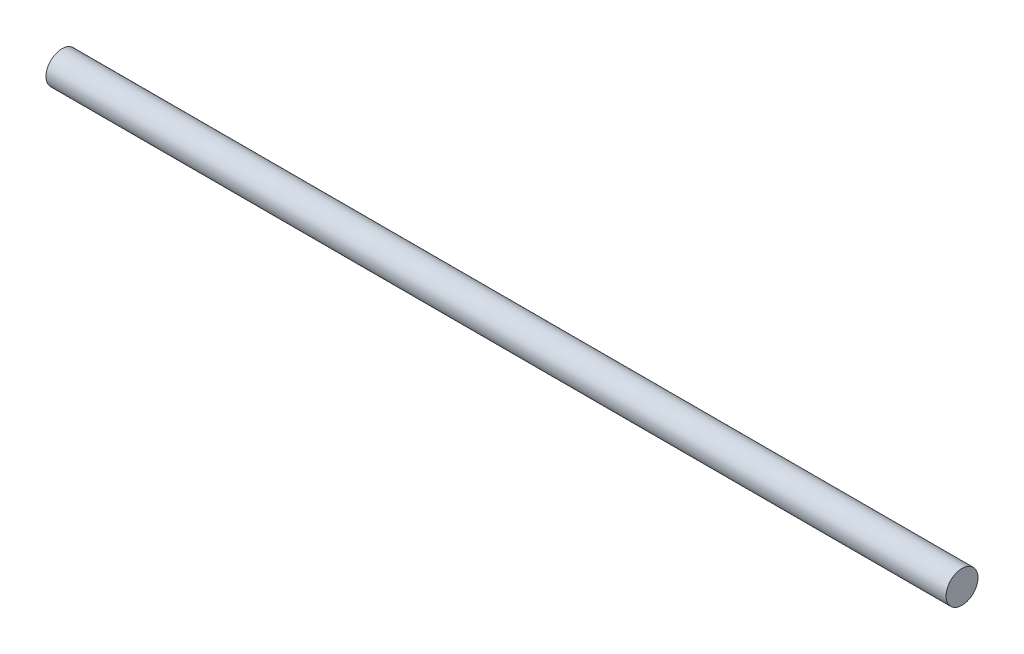
ISO-10303-21;
HEADER;
FILE_DESCRIPTION(('STEP AP214'),'2;1');
FILE_NAME('part.step','',(''),(''),'','','');
FILE_SCHEMA(('AUTOMOTIVE_DESIGN { 1 0 10303 214 1 1 1 1 }'));
ENDSEC;
DATA;
#1=APPLICATION_CONTEXT('core data for automotive mechanical design processes');
#2=APPLICATION_PROTOCOL_DEFINITION('international standard','automotive_design',2000,#1);
#3=PRODUCT_CONTEXT('',#1,'mechanical');
#4=PRODUCT('Part','Part','',(#3));
#5=PRODUCT_RELATED_PRODUCT_CATEGORY('part','',(#4));
#6=PRODUCT_DEFINITION_FORMATION('','',#4);
#7=PRODUCT_DEFINITION_CONTEXT('part definition',#1,'design');
#8=PRODUCT_DEFINITION('design','',#6,#7);
#9=PRODUCT_DEFINITION_SHAPE('','',#8);
#10=(LENGTH_UNIT() NAMED_UNIT(*) SI_UNIT(.MILLI.,.METRE.));
#11=(NAMED_UNIT(*) PLANE_ANGLE_UNIT() SI_UNIT($,.RADIAN.));
#12=(NAMED_UNIT(*) SI_UNIT($,.STERADIAN.) SOLID_ANGLE_UNIT());
#13=UNCERTAINTY_MEASURE_WITH_UNIT(LENGTH_MEASURE(1.E-05),#10,'distance_accuracy_value','');
#14=(GEOMETRIC_REPRESENTATION_CONTEXT(3) GLOBAL_UNCERTAINTY_ASSIGNED_CONTEXT((#13)) GLOBAL_UNIT_ASSIGNED_CONTEXT((#10,
#11,#12)) REPRESENTATION_CONTEXT('',''));
#15=CARTESIAN_POINT('',(0.,0.,0.));
#16=DIRECTION('',(0.,0.,1.));
#17=DIRECTION('',(1.,0.,0.));
#18=AXIS2_PLACEMENT_3D('',#15,#16,#17);
#19=CARTESIAN_POINT('',(5.,0.,0.));
#20=DIRECTION('',(-1.,0.,0.));
#21=DIRECTION('',(0.,0.,1.));
#22=AXIS2_PLACEMENT_3D('',#19,#20,#21);
#23=CYLINDRICAL_SURFACE('',#22,0.1775);
#24=CARTESIAN_POINT('',(5.,0.,0.));
#25=DIRECTION('',(1.,0.,0.));
#26=DIRECTION('',(0.,0.,-1.));
#27=AXIS2_PLACEMENT_3D('',#24,#25,#26);
#28=CIRCLE('',#27,0.1775);
#29=CARTESIAN_POINT('',(5.,0.,-0.1775));
#30=VERTEX_POINT('',#29);
#31=EDGE_CURVE('E10',#30,#30,#28,.T.);
#32=ORIENTED_EDGE('',*,*,#31,.F.);
#33=EDGE_LOOP('',(#32));
#34=FACE_BOUND('',#33,.T.);
#35=CARTESIAN_POINT('',(-5.,0.,0.));
#36=DIRECTION('',(1.,0.,0.));
#37=DIRECTION('',(0.,0.,-1.));
#38=AXIS2_PLACEMENT_3D('',#35,#36,#37);
#39=CIRCLE('',#38,0.1775);
#40=CARTESIAN_POINT('',(-5.,0.,-0.1775));
#41=VERTEX_POINT('',#40);
#42=EDGE_CURVE('E44',#41,#41,#39,.T.);
#43=ORIENTED_EDGE('',*,*,#42,.T.);
#44=EDGE_LOOP('',(#43));
#45=FACE_BOUND('',#44,.T.);
#46=ADVANCED_FACE('F41',(#34,#45),#23,.T.);
#47=CARTESIAN_POINT('',(5.,0.,0.));
#48=DIRECTION('',(1.,0.,0.));
#49=DIRECTION('',(0.,0.,-1.));
#50=AXIS2_PLACEMENT_3D('',#47,#48,#49);
#51=PLANE('',#50);
#52=ORIENTED_EDGE('',*,*,#31,.T.);
#53=EDGE_LOOP('',(#52));
#54=FACE_BOUND('',#53,.T.);
#55=ADVANCED_FACE('F60',(#54),#51,.T.);
#56=CARTESIAN_POINT('',(-5.,0.,0.));
#57=DIRECTION('',(1.,0.,0.));
#58=DIRECTION('',(0.,0.,-1.));
#59=AXIS2_PLACEMENT_3D('',#56,#57,#58);
#60=PLANE('',#59);
#61=ORIENTED_EDGE('',*,*,#42,.F.);
#62=EDGE_LOOP('',(#61));
#63=FACE_BOUND('',#62,.T.);
#64=ADVANCED_FACE('F58',(#63),#60,.F.);
#65=CLOSED_SHELL('',(#46,#55,#64));
#66=MANIFOLD_SOLID_BREP('B2',#65);
#67=ADVANCED_BREP_SHAPE_REPRESENTATION('',(#18,#66),#14);
#68=SHAPE_DEFINITION_REPRESENTATION(#9,#67);
ENDSEC;
END-ISO-10303-21;
